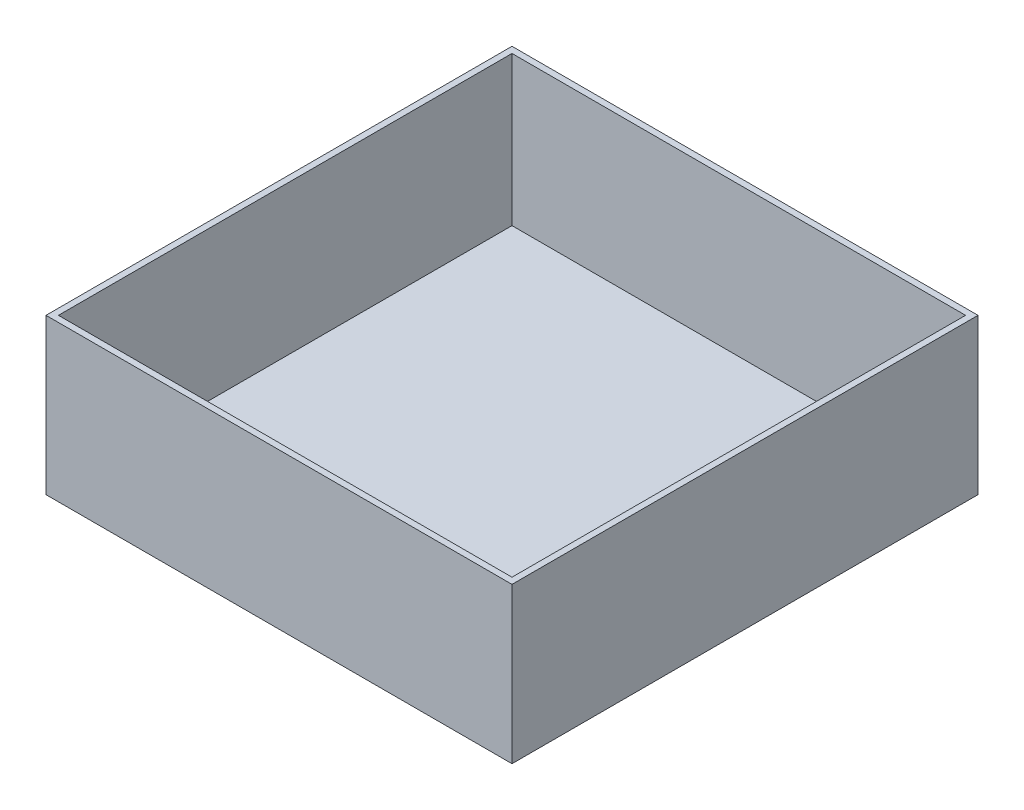
ISO-10303-21;
HEADER;
FILE_DESCRIPTION(('STEP AP214'),'2;1');
FILE_NAME('part.step','',(''),(''),'','','');
FILE_SCHEMA(('AUTOMOTIVE_DESIGN { 1 0 10303 214 1 1 1 1 }'));
ENDSEC;
DATA;
#1=APPLICATION_CONTEXT('core data for automotive mechanical design processes');
#2=APPLICATION_PROTOCOL_DEFINITION('international standard','automotive_design',2000,#1);
#3=PRODUCT_CONTEXT('',#1,'mechanical');
#4=PRODUCT('Part','Part','',(#3));
#5=PRODUCT_RELATED_PRODUCT_CATEGORY('part','',(#4));
#6=PRODUCT_DEFINITION_FORMATION('','',#4);
#7=PRODUCT_DEFINITION_CONTEXT('part definition',#1,'design');
#8=PRODUCT_DEFINITION('design','',#6,#7);
#9=PRODUCT_DEFINITION_SHAPE('','',#8);
#10=(LENGTH_UNIT() NAMED_UNIT(*) SI_UNIT(.MILLI.,.METRE.));
#11=(NAMED_UNIT(*) PLANE_ANGLE_UNIT() SI_UNIT($,.RADIAN.));
#12=(NAMED_UNIT(*) SI_UNIT($,.STERADIAN.) SOLID_ANGLE_UNIT());
#13=UNCERTAINTY_MEASURE_WITH_UNIT(LENGTH_MEASURE(1.E-05),#10,'distance_accuracy_value','');
#14=(GEOMETRIC_REPRESENTATION_CONTEXT(3) GLOBAL_UNCERTAINTY_ASSIGNED_CONTEXT((#13)) GLOBAL_UNIT_ASSIGNED_CONTEXT((#10,
#11,#12)) REPRESENTATION_CONTEXT('',''));
#15=CARTESIAN_POINT('',(0.,0.,0.));
#16=DIRECTION('',(0.,0.,1.));
#17=DIRECTION('',(1.,0.,0.));
#18=AXIS2_PLACEMENT_3D('',#15,#16,#17);
#19=CARTESIAN_POINT('',(0.,50.,0.));
#20=DIRECTION('',(0.,1.,0.));
#21=DIRECTION('',(0.,0.,1.));
#22=AXIS2_PLACEMENT_3D('',#19,#20,#21);
#23=PLANE('',#22);
#24=DIRECTION('',(0.,0.,-1.));
#25=VECTOR('',#24,1.);
#26=CARTESIAN_POINT('',(75.,50.,-75.));
#27=LINE('',#26,#25);
#28=CARTESIAN_POINT('',(75.,50.,75.));
#29=VERTEX_POINT('',#28);
#30=CARTESIAN_POINT('',(75.,50.,-75.));
#31=VERTEX_POINT('',#30);
#32=EDGE_CURVE('E141',#29,#31,#27,.T.);
#33=ORIENTED_EDGE('',*,*,#32,.T.);
#34=DIRECTION('',(-1.,0.,0.));
#35=VECTOR('',#34,1.);
#36=CARTESIAN_POINT('',(-75.,50.,-75.));
#37=LINE('',#36,#35);
#38=CARTESIAN_POINT('',(-75.,50.,-75.));
#39=VERTEX_POINT('',#38);
#40=EDGE_CURVE('E85',#31,#39,#37,.T.);
#41=ORIENTED_EDGE('',*,*,#40,.T.);
#42=DIRECTION('',(0.,0.,1.));
#43=VECTOR('',#42,1.);
#44=CARTESIAN_POINT('',(-75.,50.,-75.));
#45=LINE('',#44,#43);
#46=CARTESIAN_POINT('',(-75.,50.,75.));
#47=VERTEX_POINT('',#46);
#48=EDGE_CURVE('E144',#39,#47,#45,.T.);
#49=ORIENTED_EDGE('',*,*,#48,.T.);
#50=DIRECTION('',(1.,0.,0.));
#51=VECTOR('',#50,1.);
#52=CARTESIAN_POINT('',(-75.,50.,75.));
#53=LINE('',#52,#51);
#54=EDGE_CURVE('E57',#47,#29,#53,.T.);
#55=ORIENTED_EDGE('',*,*,#54,.T.);
#56=EDGE_LOOP('',(#33,#41,#49,#55));
#57=FACE_BOUND('',#56,.T.);
#58=DIRECTION('',(-1.,0.,0.));
#59=VECTOR('',#58,1.);
#60=CARTESIAN_POINT('',(-73.,50.,-73.));
#61=LINE('',#60,#59);
#62=CARTESIAN_POINT('',(73.,50.,-73.));
#63=VERTEX_POINT('',#62);
#64=CARTESIAN_POINT('',(-73.,50.,-73.));
#65=VERTEX_POINT('',#64);
#66=EDGE_CURVE('E111',#63,#65,#61,.T.);
#67=ORIENTED_EDGE('',*,*,#66,.F.);
#68=DIRECTION('',(0.,0.,-1.));
#69=VECTOR('',#68,1.);
#70=CARTESIAN_POINT('',(73.,50.,-73.));
#71=LINE('',#70,#69);
#72=CARTESIAN_POINT('',(73.,50.,73.));
#73=VERTEX_POINT('',#72);
#74=EDGE_CURVE('E120',#73,#63,#71,.T.);
#75=ORIENTED_EDGE('',*,*,#74,.F.);
#76=DIRECTION('',(1.,0.,0.));
#77=VECTOR('',#76,1.);
#78=CARTESIAN_POINT('',(-73.,50.,73.));
#79=LINE('',#78,#77);
#80=CARTESIAN_POINT('',(-73.,50.,73.));
#81=VERTEX_POINT('',#80);
#82=EDGE_CURVE('E126',#81,#73,#79,.T.);
#83=ORIENTED_EDGE('',*,*,#82,.F.);
#84=DIRECTION('',(0.,0.,1.));
#85=VECTOR('',#84,1.);
#86=CARTESIAN_POINT('',(-73.,50.,-73.));
#87=LINE('',#86,#85);
#88=EDGE_CURVE('E48',#65,#81,#87,.T.);
#89=ORIENTED_EDGE('',*,*,#88,.F.);
#90=EDGE_LOOP('',(#67,#75,#83,#89));
#91=FACE_BOUND('',#90,.T.);
#92=ADVANCED_FACE('F33',(#57,#91),#23,.T.);
#93=CARTESIAN_POINT('',(75.,50.,-75.));
#94=DIRECTION('',(-1.,0.,0.));
#95=DIRECTION('',(0.,0.,1.));
#96=AXIS2_PLACEMENT_3D('',#93,#94,#95);
#97=PLANE('',#96);
#98=DIRECTION('',(0.,0.,-1.));
#99=VECTOR('',#98,1.);
#100=CARTESIAN_POINT('',(75.,0.,-75.));
#101=LINE('',#100,#99);
#102=CARTESIAN_POINT('',(75.,0.,75.));
#103=VERTEX_POINT('',#102);
#104=CARTESIAN_POINT('',(75.,0.,-75.));
#105=VERTEX_POINT('',#104);
#106=EDGE_CURVE('E129',#103,#105,#101,.T.);
#107=ORIENTED_EDGE('',*,*,#106,.T.);
#108=DIRECTION('',(0.,-1.,0.));
#109=VECTOR('',#108,1.);
#110=CARTESIAN_POINT('',(75.,50.,-75.));
#111=LINE('',#110,#109);
#112=EDGE_CURVE('E11',#31,#105,#111,.T.);
#113=ORIENTED_EDGE('',*,*,#112,.F.);
#114=ORIENTED_EDGE('',*,*,#32,.F.);
#115=DIRECTION('',(0.,-1.,0.));
#116=VECTOR('',#115,1.);
#117=CARTESIAN_POINT('',(75.,50.,75.));
#118=LINE('',#117,#116);
#119=EDGE_CURVE('E147',#29,#103,#118,.T.);
#120=ORIENTED_EDGE('',*,*,#119,.T.);
#121=EDGE_LOOP('',(#107,#113,#114,#120));
#122=FACE_BOUND('',#121,.T.);
#123=ADVANCED_FACE('F35',(#122),#97,.F.);
#124=CARTESIAN_POINT('',(-75.,50.,-75.));
#125=DIRECTION('',(0.,0.,1.));
#126=DIRECTION('',(1.,0.,0.));
#127=AXIS2_PLACEMENT_3D('',#124,#125,#126);
#128=PLANE('',#127);
#129=DIRECTION('',(-1.,0.,0.));
#130=VECTOR('',#129,1.);
#131=CARTESIAN_POINT('',(-75.,0.,-75.));
#132=LINE('',#131,#130);
#133=CARTESIAN_POINT('',(-75.,0.,-75.));
#134=VERTEX_POINT('',#133);
#135=EDGE_CURVE('E150',#105,#134,#132,.T.);
#136=ORIENTED_EDGE('',*,*,#135,.T.);
#137=DIRECTION('',(0.,-1.,0.));
#138=VECTOR('',#137,1.);
#139=CARTESIAN_POINT('',(-75.,50.,-75.));
#140=LINE('',#139,#138);
#141=EDGE_CURVE('E41',#39,#134,#140,.T.);
#142=ORIENTED_EDGE('',*,*,#141,.F.);
#143=ORIENTED_EDGE('',*,*,#40,.F.);
#144=ORIENTED_EDGE('',*,*,#112,.T.);
#145=EDGE_LOOP('',(#136,#142,#143,#144));
#146=FACE_BOUND('',#145,.T.);
#147=ADVANCED_FACE('F177',(#146),#128,.F.);
#148=CARTESIAN_POINT('',(-75.,50.,-75.));
#149=DIRECTION('',(1.,0.,0.));
#150=DIRECTION('',(0.,0.,-1.));
#151=AXIS2_PLACEMENT_3D('',#148,#149,#150);
#152=PLANE('',#151);
#153=DIRECTION('',(0.,0.,1.));
#154=VECTOR('',#153,1.);
#155=CARTESIAN_POINT('',(-75.,0.,-75.));
#156=LINE('',#155,#154);
#157=CARTESIAN_POINT('',(-75.,0.,75.));
#158=VERTEX_POINT('',#157);
#159=EDGE_CURVE('E152',#134,#158,#156,.T.);
#160=ORIENTED_EDGE('',*,*,#159,.T.);
#161=DIRECTION('',(0.,-1.,0.));
#162=VECTOR('',#161,1.);
#163=CARTESIAN_POINT('',(-75.,50.,75.));
#164=LINE('',#163,#162);
#165=EDGE_CURVE('E156',#47,#158,#164,.T.);
#166=ORIENTED_EDGE('',*,*,#165,.F.);
#167=ORIENTED_EDGE('',*,*,#48,.F.);
#168=ORIENTED_EDGE('',*,*,#141,.T.);
#169=EDGE_LOOP('',(#160,#166,#167,#168));
#170=FACE_BOUND('',#169,.T.);
#171=ADVANCED_FACE('F161',(#170),#152,.F.);
#172=CARTESIAN_POINT('',(-75.,50.,75.));
#173=DIRECTION('',(0.,0.,-1.));
#174=DIRECTION('',(-1.,0.,0.));
#175=AXIS2_PLACEMENT_3D('',#172,#173,#174);
#176=PLANE('',#175);
#177=DIRECTION('',(1.,0.,0.));
#178=VECTOR('',#177,1.);
#179=CARTESIAN_POINT('',(-75.,0.,75.));
#180=LINE('',#179,#178);
#181=EDGE_CURVE('E78',#158,#103,#180,.T.);
#182=ORIENTED_EDGE('',*,*,#181,.T.);
#183=ORIENTED_EDGE('',*,*,#119,.F.);
#184=ORIENTED_EDGE('',*,*,#54,.F.);
#185=ORIENTED_EDGE('',*,*,#165,.T.);
#186=EDGE_LOOP('',(#182,#183,#184,#185));
#187=FACE_BOUND('',#186,.T.);
#188=ADVANCED_FACE('F169',(#187),#176,.F.);
#189=CARTESIAN_POINT('',(0.,0.,0.));
#190=DIRECTION('',(0.,1.,0.));
#191=DIRECTION('',(0.,0.,1.));
#192=AXIS2_PLACEMENT_3D('',#189,#190,#191);
#193=PLANE('',#192);
#194=ORIENTED_EDGE('',*,*,#106,.F.);
#195=ORIENTED_EDGE('',*,*,#181,.F.);
#196=ORIENTED_EDGE('',*,*,#159,.F.);
#197=ORIENTED_EDGE('',*,*,#135,.F.);
#198=EDGE_LOOP('',(#194,#195,#196,#197));
#199=FACE_BOUND('',#198,.T.);
#200=ADVANCED_FACE('F165',(#199),#193,.F.);
#201=CARTESIAN_POINT('',(73.,256.475180106472,-73.));
#202=DIRECTION('',(-1.,0.,0.));
#203=DIRECTION('',(0.,0.,1.));
#204=AXIS2_PLACEMENT_3D('',#201,#202,#203);
#205=PLANE('',#204);
#206=ORIENTED_EDGE('',*,*,#74,.T.);
#207=DIRECTION('',(0.,-1.,0.));
#208=VECTOR('',#207,1.);
#209=CARTESIAN_POINT('',(73.,256.475180106472,-73.));
#210=LINE('',#209,#208);
#211=CARTESIAN_POINT('',(73.,2.,-73.));
#212=VERTEX_POINT('',#211);
#213=EDGE_CURVE('E107',#63,#212,#210,.T.);
#214=ORIENTED_EDGE('',*,*,#213,.T.);
#215=DIRECTION('',(0.,0.,-1.));
#216=VECTOR('',#215,1.);
#217=CARTESIAN_POINT('',(73.,2.,-73.));
#218=LINE('',#217,#216);
#219=CARTESIAN_POINT('',(73.,2.,73.));
#220=VERTEX_POINT('',#219);
#221=EDGE_CURVE('E117',#220,#212,#218,.T.);
#222=ORIENTED_EDGE('',*,*,#221,.F.);
#223=DIRECTION('',(0.,-1.,0.));
#224=VECTOR('',#223,1.);
#225=CARTESIAN_POINT('',(73.,256.475180106472,73.));
#226=LINE('',#225,#224);
#227=EDGE_CURVE('E122',#73,#220,#226,.T.);
#228=ORIENTED_EDGE('',*,*,#227,.F.);
#229=EDGE_LOOP('',(#206,#214,#222,#228));
#230=FACE_BOUND('',#229,.T.);
#231=ADVANCED_FACE('F121',(#230),#205,.T.);
#232=CARTESIAN_POINT('',(-73.,256.475180106472,-73.));
#233=DIRECTION('',(0.,0.,1.));
#234=DIRECTION('',(1.,0.,0.));
#235=AXIS2_PLACEMENT_3D('',#232,#233,#234);
#236=PLANE('',#235);
#237=ORIENTED_EDGE('',*,*,#66,.T.);
#238=DIRECTION('',(0.,-1.,0.));
#239=VECTOR('',#238,1.);
#240=CARTESIAN_POINT('',(-73.,256.475180106472,-73.));
#241=LINE('',#240,#239);
#242=CARTESIAN_POINT('',(-73.,2.,-73.));
#243=VERTEX_POINT('',#242);
#244=EDGE_CURVE('E135',#65,#243,#241,.T.);
#245=ORIENTED_EDGE('',*,*,#244,.T.);
#246=DIRECTION('',(-1.,0.,0.));
#247=VECTOR('',#246,1.);
#248=CARTESIAN_POINT('',(-73.,2.,-73.));
#249=LINE('',#248,#247);
#250=EDGE_CURVE('E113',#212,#243,#249,.T.);
#251=ORIENTED_EDGE('',*,*,#250,.F.);
#252=ORIENTED_EDGE('',*,*,#213,.F.);
#253=EDGE_LOOP('',(#237,#245,#251,#252));
#254=FACE_BOUND('',#253,.T.);
#255=ADVANCED_FACE('F109',(#254),#236,.T.);
#256=CARTESIAN_POINT('',(-73.,256.475180106472,-73.));
#257=DIRECTION('',(1.,0.,0.));
#258=DIRECTION('',(0.,0.,-1.));
#259=AXIS2_PLACEMENT_3D('',#256,#257,#258);
#260=PLANE('',#259);
#261=ORIENTED_EDGE('',*,*,#88,.T.);
#262=DIRECTION('',(0.,-1.,0.));
#263=VECTOR('',#262,1.);
#264=CARTESIAN_POINT('',(-73.,256.475180106472,73.));
#265=LINE('',#264,#263);
#266=CARTESIAN_POINT('',(-73.,2.,73.));
#267=VERTEX_POINT('',#266);
#268=EDGE_CURVE('E138',#81,#267,#265,.T.);
#269=ORIENTED_EDGE('',*,*,#268,.T.);
#270=DIRECTION('',(0.,0.,1.));
#271=VECTOR('',#270,1.);
#272=CARTESIAN_POINT('',(-73.,2.,-73.));
#273=LINE('',#272,#271);
#274=EDGE_CURVE('E137',#243,#267,#273,.T.);
#275=ORIENTED_EDGE('',*,*,#274,.F.);
#276=ORIENTED_EDGE('',*,*,#244,.F.);
#277=EDGE_LOOP('',(#261,#269,#275,#276));
#278=FACE_BOUND('',#277,.T.);
#279=ADVANCED_FACE('F189',(#278),#260,.T.);
#280=CARTESIAN_POINT('',(-73.,256.475180106472,73.));
#281=DIRECTION('',(0.,0.,-1.));
#282=DIRECTION('',(-1.,0.,0.));
#283=AXIS2_PLACEMENT_3D('',#280,#281,#282);
#284=PLANE('',#283);
#285=ORIENTED_EDGE('',*,*,#82,.T.);
#286=ORIENTED_EDGE('',*,*,#227,.T.);
#287=DIRECTION('',(1.,0.,0.));
#288=VECTOR('',#287,1.);
#289=CARTESIAN_POINT('',(-73.,2.,73.));
#290=LINE('',#289,#288);
#291=EDGE_CURVE('E133',#267,#220,#290,.T.);
#292=ORIENTED_EDGE('',*,*,#291,.F.);
#293=ORIENTED_EDGE('',*,*,#268,.F.);
#294=EDGE_LOOP('',(#285,#286,#292,#293));
#295=FACE_BOUND('',#294,.T.);
#296=ADVANCED_FACE('F192',(#295),#284,.T.);
#297=CARTESIAN_POINT('',(0.,2.,0.));
#298=DIRECTION('',(0.,1.,0.));
#299=DIRECTION('',(0.,0.,1.));
#300=AXIS2_PLACEMENT_3D('',#297,#298,#299);
#301=PLANE('',#300);
#302=ORIENTED_EDGE('',*,*,#221,.T.);
#303=ORIENTED_EDGE('',*,*,#250,.T.);
#304=ORIENTED_EDGE('',*,*,#274,.T.);
#305=ORIENTED_EDGE('',*,*,#291,.T.);
#306=EDGE_LOOP('',(#302,#303,#304,#305));
#307=FACE_BOUND('',#306,.T.);
#308=ADVANCED_FACE('F195',(#307),#301,.T.);
#309=CLOSED_SHELL('',(#92,#123,#147,#171,#188,#200,#231,#255,#279,#296,#308));
#310=MANIFOLD_SOLID_BREP('B2',#309);
#311=ADVANCED_BREP_SHAPE_REPRESENTATION('',(#18,#310),#14);
#312=SHAPE_DEFINITION_REPRESENTATION(#9,#311);
ENDSEC;
END-ISO-10303-21;
